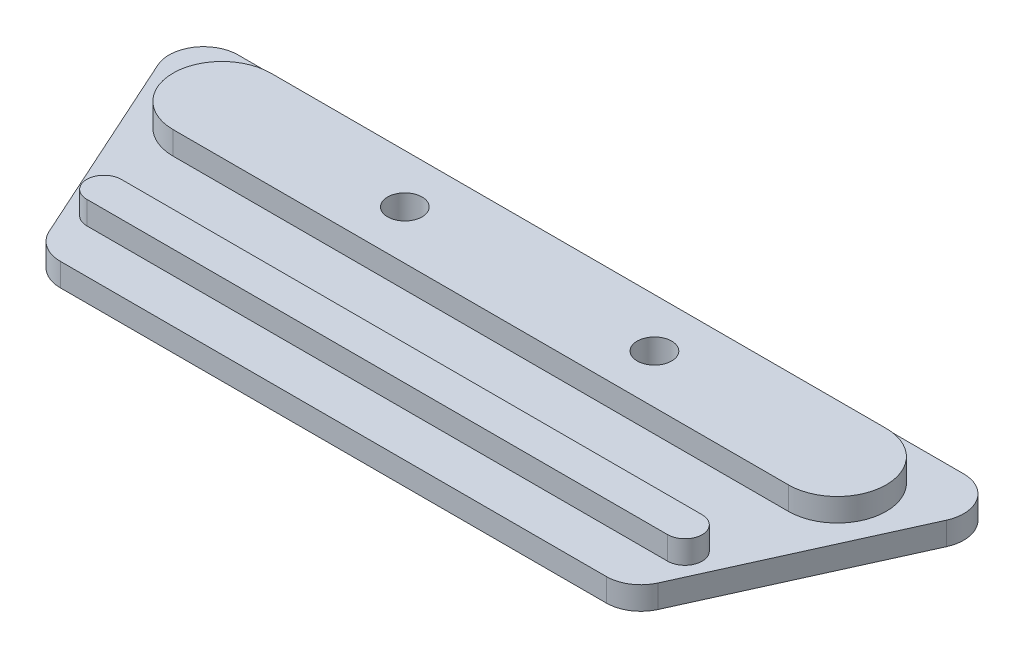
ISO-10303-21;
HEADER;
FILE_DESCRIPTION(('STEP AP214'),'2;1');
FILE_NAME('part.step','',(''),(''),'','','');
FILE_SCHEMA(('AUTOMOTIVE_DESIGN { 1 0 10303 214 1 1 1 1 }'));
ENDSEC;
DATA;
#1=APPLICATION_CONTEXT('core data for automotive mechanical design processes');
#2=APPLICATION_PROTOCOL_DEFINITION('international standard','automotive_design',2000,#1);
#3=PRODUCT_CONTEXT('',#1,'mechanical');
#4=PRODUCT('Part','Part','',(#3));
#5=PRODUCT_RELATED_PRODUCT_CATEGORY('part','',(#4));
#6=PRODUCT_DEFINITION_FORMATION('','',#4);
#7=PRODUCT_DEFINITION_CONTEXT('part definition',#1,'design');
#8=PRODUCT_DEFINITION('design','',#6,#7);
#9=PRODUCT_DEFINITION_SHAPE('','',#8);
#10=(LENGTH_UNIT() NAMED_UNIT(*) SI_UNIT(.MILLI.,.METRE.));
#11=(NAMED_UNIT(*) PLANE_ANGLE_UNIT() SI_UNIT($,.RADIAN.));
#12=(NAMED_UNIT(*) SI_UNIT($,.STERADIAN.) SOLID_ANGLE_UNIT());
#13=UNCERTAINTY_MEASURE_WITH_UNIT(LENGTH_MEASURE(1.E-05),#10,'distance_accuracy_value','');
#14=(GEOMETRIC_REPRESENTATION_CONTEXT(3) GLOBAL_UNCERTAINTY_ASSIGNED_CONTEXT((#13)) GLOBAL_UNIT_ASSIGNED_CONTEXT((#10,
#11,#12)) REPRESENTATION_CONTEXT('',''));
#15=CARTESIAN_POINT('',(0.,0.,0.));
#16=DIRECTION('',(0.,0.,1.));
#17=DIRECTION('',(1.,0.,0.));
#18=AXIS2_PLACEMENT_3D('',#15,#16,#17);
#19=CARTESIAN_POINT('',(0.,2.,0.));
#20=DIRECTION('',(0.,1.,0.));
#21=DIRECTION('',(0.,0.,1.));
#22=AXIS2_PLACEMENT_3D('',#19,#20,#21);
#23=PLANE('',#22);
#24=DIRECTION('',(0.412073994231826,0.,-0.911150384556704));
#25=VECTOR('',#24,1.);
#26=CARTESIAN_POINT('',(23.3094519926705,2.,10.5418591143413));
#27=LINE('',#26,#25);
#28=CARTESIAN_POINT('',(26.4692904072244,2.,3.55503629402501));
#29=VERTEX_POINT('',#28);
#30=CARTESIAN_POINT('',(34.2779248520572,2.,-13.7108925849264));
#31=VERTEX_POINT('',#30);
#32=EDGE_CURVE('E247',#29,#31,#27,.T.);
#33=ORIENTED_EDGE('',*,*,#32,.T.);
#34=CARTESIAN_POINT('',(31.5444736983871,2.,-14.9471145676219));
#35=DIRECTION('',(0.,1.,0.));
#36=DIRECTION('',(0.,0.,1.));
#37=AXIS2_PLACEMENT_3D('',#34,#35,#36);
#38=CIRCLE('',#37,3.);
#39=CARTESIAN_POINT('',(31.544473698387,2.,-17.9471145676219));
#40=VERTEX_POINT('',#39);
#41=EDGE_CURVE('E251',#31,#40,#38,.T.);
#42=ORIENTED_EDGE('',*,*,#41,.T.);
#43=DIRECTION('',(1.,0.,0.));
#44=VECTOR('',#43,1.);
#45=CARTESIAN_POINT('',(0.,2.,-17.9471145676219));
#46=LINE('',#45,#44);
#47=CARTESIAN_POINT('',(-31.5444736983869,2.,-17.9471145676219));
#48=VERTEX_POINT('',#47);
#49=EDGE_CURVE('E255',#48,#40,#46,.T.);
#50=ORIENTED_EDGE('',*,*,#49,.F.);
#51=CARTESIAN_POINT('',(-31.5444736983869,2.,-14.9471145676219));
#52=DIRECTION('',(0.,1.,0.));
#53=DIRECTION('',(0.,0.,1.));
#54=AXIS2_PLACEMENT_3D('',#51,#52,#53);
#55=CIRCLE('',#54,3.);
#56=CARTESIAN_POINT('',(-34.277924852057,2.,-13.7108925849264));
#57=VERTEX_POINT('',#56);
#58=EDGE_CURVE('E259',#57,#48,#55,.F.);
#59=ORIENTED_EDGE('',*,*,#58,.F.);
#60=DIRECTION('',(-0.412073994231826,0.,-0.911150384556704));
#61=VECTOR('',#60,1.);
#62=CARTESIAN_POINT('',(-23.3094519926703,2.,10.5418591143413));
#63=LINE('',#62,#61);
#64=CARTESIAN_POINT('',(-26.4692904072242,2.,3.55503629402501));
#65=VERTEX_POINT('',#64);
#66=EDGE_CURVE('E263',#65,#57,#63,.T.);
#67=ORIENTED_EDGE('',*,*,#66,.F.);
#68=CARTESIAN_POINT('',(-23.7358392535541,2.,2.31881431132954));
#69=DIRECTION('',(0.,1.,0.));
#70=DIRECTION('',(0.,0.,1.));
#71=AXIS2_PLACEMENT_3D('',#68,#69,#70);
#72=CIRCLE('',#71,3.);
#73=CARTESIAN_POINT('',(-23.7358392535541,2.,5.31881431132954));
#74=VERTEX_POINT('',#73);
#75=EDGE_CURVE('E267',#74,#65,#72,.F.);
#76=ORIENTED_EDGE('',*,*,#75,.F.);
#77=DIRECTION('',(-1.,0.,0.));
#78=VECTOR('',#77,1.);
#79=CARTESIAN_POINT('',(0.,2.,5.31881431132954));
#80=LINE('',#79,#78);
#81=CARTESIAN_POINT('',(23.7358392535542,2.,5.31881431132954));
#82=VERTEX_POINT('',#81);
#83=EDGE_CURVE('E271',#82,#74,#80,.T.);
#84=ORIENTED_EDGE('',*,*,#83,.F.);
#85=CARTESIAN_POINT('',(23.7358392535542,2.,2.31881431132954));
#86=DIRECTION('',(0.,1.,0.));
#87=DIRECTION('',(0.,0.,1.));
#88=AXIS2_PLACEMENT_3D('',#85,#86,#87);
#89=CIRCLE('',#88,3.);
#90=EDGE_CURVE('E275',#82,#29,#89,.T.);
#91=ORIENTED_EDGE('',*,*,#90,.T.);
#92=EDGE_LOOP('',(#33,#42,#50,#59,#67,#76,#84,#91));
#93=FACE_BOUND('',#92,.T.);
#94=CARTESIAN_POINT('',(26.7500000000001,2.,-11.75));
#95=DIRECTION('',(0.,1.,0.));
#96=DIRECTION('',(0.,0.,1.));
#97=AXIS2_PLACEMENT_3D('',#94,#95,#96);
#98=CIRCLE('',#97,4.25);
#99=CARTESIAN_POINT('',(26.7500000000001,2.,-16.));
#100=VERTEX_POINT('',#99);
#101=CARTESIAN_POINT('',(26.7500000000001,2.,-7.5));
#102=VERTEX_POINT('',#101);
#103=EDGE_CURVE('E238',#100,#102,#98,.F.);
#104=ORIENTED_EDGE('',*,*,#103,.T.);
#105=DIRECTION('',(-1.,0.,0.));
#106=VECTOR('',#105,1.);
#107=CARTESIAN_POINT('',(0.,2.,-7.5));
#108=LINE('',#107,#106);
#109=CARTESIAN_POINT('',(-26.7499999999999,2.,-7.5));
#110=VERTEX_POINT('',#109);
#111=EDGE_CURVE('E242',#102,#110,#108,.T.);
#112=ORIENTED_EDGE('',*,*,#111,.T.);
#113=CARTESIAN_POINT('',(-26.7499999999999,2.,-11.75));
#114=DIRECTION('',(0.,1.,0.));
#115=DIRECTION('',(0.,0.,1.));
#116=AXIS2_PLACEMENT_3D('',#113,#114,#115);
#117=CIRCLE('',#116,4.25);
#118=CARTESIAN_POINT('',(-26.7499999999999,2.,-16.));
#119=VERTEX_POINT('',#118);
#120=EDGE_CURVE('E230',#110,#119,#117,.F.);
#121=ORIENTED_EDGE('',*,*,#120,.T.);
#122=DIRECTION('',(-1.,0.,0.));
#123=VECTOR('',#122,1.);
#124=CARTESIAN_POINT('',(0.,2.,-16.));
#125=LINE('',#124,#123);
#126=EDGE_CURVE('E234',#100,#119,#125,.T.);
#127=ORIENTED_EDGE('',*,*,#126,.F.);
#128=EDGE_LOOP('',(#104,#112,#121,#127));
#129=FACE_BOUND('',#128,.T.);
#130=CARTESIAN_POINT('',(25.2500000000001,2.,0.));
#131=DIRECTION('',(0.,1.,0.));
#132=DIRECTION('',(0.,0.,1.));
#133=AXIS2_PLACEMENT_3D('',#130,#131,#132);
#134=CIRCLE('',#133,1.5);
#135=CARTESIAN_POINT('',(25.2500000000001,2.,-1.5));
#136=VERTEX_POINT('',#135);
#137=CARTESIAN_POINT('',(25.2500000000001,2.,1.5));
#138=VERTEX_POINT('',#137);
#139=EDGE_CURVE('E55',#136,#138,#134,.F.);
#140=ORIENTED_EDGE('',*,*,#139,.T.);
#141=DIRECTION('',(-1.,0.,0.));
#142=VECTOR('',#141,1.);
#143=CARTESIAN_POINT('',(0.,2.,1.5));
#144=LINE('',#143,#142);
#145=CARTESIAN_POINT('',(-25.2499999999999,2.,1.5));
#146=VERTEX_POINT('',#145);
#147=EDGE_CURVE('E175',#138,#146,#144,.T.);
#148=ORIENTED_EDGE('',*,*,#147,.T.);
#149=CARTESIAN_POINT('',(-25.2499999999999,2.,0.));
#150=DIRECTION('',(0.,1.,0.));
#151=DIRECTION('',(0.,0.,1.));
#152=AXIS2_PLACEMENT_3D('',#149,#150,#151);
#153=CIRCLE('',#152,1.5);
#154=CARTESIAN_POINT('',(-25.2499999999999,2.,-1.5));
#155=VERTEX_POINT('',#154);
#156=EDGE_CURVE('E177',#155,#146,#153,.T.);
#157=ORIENTED_EDGE('',*,*,#156,.F.);
#158=DIRECTION('',(-1.,0.,0.));
#159=VECTOR('',#158,1.);
#160=CARTESIAN_POINT('',(0.,2.,-1.5));
#161=LINE('',#160,#159);
#162=EDGE_CURVE('E60',#136,#155,#161,.T.);
#163=ORIENTED_EDGE('',*,*,#162,.F.);
#164=EDGE_LOOP('',(#140,#148,#157,#163));
#165=FACE_BOUND('',#164,.T.);
#166=ADVANCED_FACE('F39',(#93,#129,#165),#23,.T.);
#167=CARTESIAN_POINT('',(23.3094519926705,2.,10.5418591143413));
#168=DIRECTION('',(-0.911150384556704,0.,-0.412073994231826));
#169=DIRECTION('',(-0.412073994231826,0.,0.911150384556704));
#170=AXIS2_PLACEMENT_3D('',#167,#168,#169);
#171=PLANE('',#170);
#172=DIRECTION('',(0.412073994231826,0.,-0.911150384556704));
#173=VECTOR('',#172,1.);
#174=CARTESIAN_POINT('',(23.3094519926705,0.,10.5418591143413));
#175=LINE('',#174,#173);
#176=CARTESIAN_POINT('',(26.4692904072244,0.,3.55503629402501));
#177=VERTEX_POINT('',#176);
#178=CARTESIAN_POINT('',(34.2779248520572,0.,-13.7108925849264));
#179=VERTEX_POINT('',#178);
#180=EDGE_CURVE('E246',#177,#179,#175,.T.);
#181=ORIENTED_EDGE('',*,*,#180,.T.);
#182=DIRECTION('',(0.,-1.,0.));
#183=VECTOR('',#182,1.);
#184=CARTESIAN_POINT('',(34.2779248520572,2.,-13.7108925849264));
#185=LINE('',#184,#183);
#186=EDGE_CURVE('E11',#31,#179,#185,.T.);
#187=ORIENTED_EDGE('',*,*,#186,.F.);
#188=ORIENTED_EDGE('',*,*,#32,.F.);
#189=DIRECTION('',(0.,-1.,0.));
#190=VECTOR('',#189,1.);
#191=CARTESIAN_POINT('',(26.4692904072244,2.,3.55503629402501));
#192=LINE('',#191,#190);
#193=EDGE_CURVE('E278',#29,#177,#192,.T.);
#194=ORIENTED_EDGE('',*,*,#193,.T.);
#195=EDGE_LOOP('',(#181,#187,#188,#194));
#196=FACE_BOUND('',#195,.T.);
#197=ADVANCED_FACE('F41',(#196),#171,.F.);
#198=CARTESIAN_POINT('',(31.5444736983871,2.,-14.9471145676219));
#199=DIRECTION('',(0.,-1.,0.));
#200=DIRECTION('',(0.,0.,-1.));
#201=AXIS2_PLACEMENT_3D('',#198,#199,#200);
#202=CYLINDRICAL_SURFACE('',#201,3.);
#203=CARTESIAN_POINT('',(31.5444736983871,0.,-14.9471145676219));
#204=DIRECTION('',(0.,1.,0.));
#205=DIRECTION('',(0.,0.,1.));
#206=AXIS2_PLACEMENT_3D('',#203,#204,#205);
#207=CIRCLE('',#206,3.);
#208=CARTESIAN_POINT('',(31.544473698387,0.,-17.9471145676219));
#209=VERTEX_POINT('',#208);
#210=EDGE_CURVE('E282',#179,#209,#207,.T.);
#211=ORIENTED_EDGE('',*,*,#210,.T.);
#212=DIRECTION('',(0.,-1.,0.));
#213=VECTOR('',#212,1.);
#214=CARTESIAN_POINT('',(31.544473698387,2.,-17.9471145676219));
#215=LINE('',#214,#213);
#216=EDGE_CURVE('E48',#40,#209,#215,.T.);
#217=ORIENTED_EDGE('',*,*,#216,.F.);
#218=ORIENTED_EDGE('',*,*,#41,.F.);
#219=ORIENTED_EDGE('',*,*,#186,.T.);
#220=EDGE_LOOP('',(#211,#217,#218,#219));
#221=FACE_BOUND('',#220,.T.);
#222=ADVANCED_FACE('F340',(#221),#202,.T.);
#223=CARTESIAN_POINT('',(0.,2.,-17.9471145676219));
#224=DIRECTION('',(0.,0.,-1.));
#225=DIRECTION('',(-1.,0.,0.));
#226=AXIS2_PLACEMENT_3D('',#223,#224,#225);
#227=PLANE('',#226);
#228=DIRECTION('',(1.,0.,0.));
#229=VECTOR('',#228,1.);
#230=CARTESIAN_POINT('',(0.,0.,-17.9471145676219));
#231=LINE('',#230,#229);
#232=CARTESIAN_POINT('',(-31.5444736983869,0.,-17.9471145676219));
#233=VERTEX_POINT('',#232);
#234=EDGE_CURVE('E286',#233,#209,#231,.T.);
#235=ORIENTED_EDGE('',*,*,#234,.F.);
#236=DIRECTION('',(0.,-1.,0.));
#237=VECTOR('',#236,1.);
#238=CARTESIAN_POINT('',(-31.5444736983869,2.,-17.9471145676219));
#239=LINE('',#238,#237);
#240=EDGE_CURVE('E331',#48,#233,#239,.T.);
#241=ORIENTED_EDGE('',*,*,#240,.F.);
#242=ORIENTED_EDGE('',*,*,#49,.T.);
#243=ORIENTED_EDGE('',*,*,#216,.T.);
#244=EDGE_LOOP('',(#235,#241,#242,#243));
#245=FACE_BOUND('',#244,.T.);
#246=ADVANCED_FACE('F337',(#245),#227,.T.);
#247=CARTESIAN_POINT('',(-31.5444736983869,2.,-14.9471145676219));
#248=DIRECTION('',(0.,-1.,0.));
#249=DIRECTION('',(0.,0.,-1.));
#250=AXIS2_PLACEMENT_3D('',#247,#248,#249);
#251=CYLINDRICAL_SURFACE('',#250,3.);
#252=CARTESIAN_POINT('',(-31.5444736983869,0.,-14.9471145676219));
#253=DIRECTION('',(0.,1.,0.));
#254=DIRECTION('',(0.,0.,1.));
#255=AXIS2_PLACEMENT_3D('',#252,#253,#254);
#256=CIRCLE('',#255,3.);
#257=CARTESIAN_POINT('',(-34.277924852057,0.,-13.7108925849264));
#258=VERTEX_POINT('',#257);
#259=EDGE_CURVE('E290',#258,#233,#256,.F.);
#260=ORIENTED_EDGE('',*,*,#259,.F.);
#261=DIRECTION('',(0.,-1.,0.));
#262=VECTOR('',#261,1.);
#263=CARTESIAN_POINT('',(-34.277924852057,2.,-13.7108925849264));
#264=LINE('',#263,#262);
#265=EDGE_CURVE('E328',#57,#258,#264,.T.);
#266=ORIENTED_EDGE('',*,*,#265,.F.);
#267=ORIENTED_EDGE('',*,*,#58,.T.);
#268=ORIENTED_EDGE('',*,*,#240,.T.);
#269=EDGE_LOOP('',(#260,#266,#267,#268));
#270=FACE_BOUND('',#269,.T.);
#271=ADVANCED_FACE('F349',(#270),#251,.T.);
#272=CARTESIAN_POINT('',(-23.3094519926703,2.,10.5418591143413));
#273=DIRECTION('',(-0.911150384556704,0.,0.412073994231826));
#274=DIRECTION('',(0.412073994231826,0.,0.911150384556704));
#275=AXIS2_PLACEMENT_3D('',#272,#273,#274);
#276=PLANE('',#275);
#277=DIRECTION('',(-0.412073994231826,0.,-0.911150384556704));
#278=VECTOR('',#277,1.);
#279=CARTESIAN_POINT('',(-23.3094519926703,0.,10.5418591143413));
#280=LINE('',#279,#278);
#281=CARTESIAN_POINT('',(-26.4692904072242,0.,3.55503629402501));
#282=VERTEX_POINT('',#281);
#283=EDGE_CURVE('E294',#282,#258,#280,.T.);
#284=ORIENTED_EDGE('',*,*,#283,.F.);
#285=DIRECTION('',(0.,-1.,0.));
#286=VECTOR('',#285,1.);
#287=CARTESIAN_POINT('',(-26.4692904072242,2.,3.55503629402501));
#288=LINE('',#287,#286);
#289=EDGE_CURVE('E325',#65,#282,#288,.T.);
#290=ORIENTED_EDGE('',*,*,#289,.F.);
#291=ORIENTED_EDGE('',*,*,#66,.T.);
#292=ORIENTED_EDGE('',*,*,#265,.T.);
#293=EDGE_LOOP('',(#284,#290,#291,#292));
#294=FACE_BOUND('',#293,.T.);
#295=ADVANCED_FACE('F369',(#294),#276,.T.);
#296=CARTESIAN_POINT('',(-23.7358392535541,2.,2.31881431132954));
#297=DIRECTION('',(0.,-1.,0.));
#298=DIRECTION('',(0.,0.,-1.));
#299=AXIS2_PLACEMENT_3D('',#296,#297,#298);
#300=CYLINDRICAL_SURFACE('',#299,3.);
#301=CARTESIAN_POINT('',(-23.7358392535541,0.,2.31881431132954));
#302=DIRECTION('',(0.,1.,0.));
#303=DIRECTION('',(0.,0.,1.));
#304=AXIS2_PLACEMENT_3D('',#301,#302,#303);
#305=CIRCLE('',#304,3.);
#306=CARTESIAN_POINT('',(-23.7358392535541,0.,5.31881431132954));
#307=VERTEX_POINT('',#306);
#308=EDGE_CURVE('E298',#307,#282,#305,.F.);
#309=ORIENTED_EDGE('',*,*,#308,.F.);
#310=DIRECTION('',(0.,-1.,0.));
#311=VECTOR('',#310,1.);
#312=CARTESIAN_POINT('',(-23.7358392535541,2.,5.31881431132954));
#313=LINE('',#312,#311);
#314=EDGE_CURVE('E322',#74,#307,#313,.T.);
#315=ORIENTED_EDGE('',*,*,#314,.F.);
#316=ORIENTED_EDGE('',*,*,#75,.T.);
#317=ORIENTED_EDGE('',*,*,#289,.T.);
#318=EDGE_LOOP('',(#309,#315,#316,#317));
#319=FACE_BOUND('',#318,.T.);
#320=ADVANCED_FACE('F367',(#319),#300,.T.);
#321=CARTESIAN_POINT('',(0.,2.,5.31881431132954));
#322=DIRECTION('',(0.,0.,1.));
#323=DIRECTION('',(1.,0.,0.));
#324=AXIS2_PLACEMENT_3D('',#321,#322,#323);
#325=PLANE('',#324);
#326=DIRECTION('',(-1.,0.,0.));
#327=VECTOR('',#326,1.);
#328=CARTESIAN_POINT('',(0.,0.,5.31881431132954));
#329=LINE('',#328,#327);
#330=CARTESIAN_POINT('',(23.7358392535542,0.,5.31881431132954));
#331=VERTEX_POINT('',#330);
#332=EDGE_CURVE('E302',#331,#307,#329,.T.);
#333=ORIENTED_EDGE('',*,*,#332,.F.);
#334=DIRECTION('',(0.,-1.,0.));
#335=VECTOR('',#334,1.);
#336=CARTESIAN_POINT('',(23.7358392535542,2.,5.31881431132954));
#337=LINE('',#336,#335);
#338=EDGE_CURVE('E319',#82,#331,#337,.T.);
#339=ORIENTED_EDGE('',*,*,#338,.F.);
#340=ORIENTED_EDGE('',*,*,#83,.T.);
#341=ORIENTED_EDGE('',*,*,#314,.T.);
#342=EDGE_LOOP('',(#333,#339,#340,#341));
#343=FACE_BOUND('',#342,.T.);
#344=ADVANCED_FACE('F363',(#343),#325,.T.);
#345=CARTESIAN_POINT('',(-10.8499999999999,2.,-11.75));
#346=DIRECTION('',(0.,-1.,0.));
#347=DIRECTION('',(0.,0.,-1.));
#348=AXIS2_PLACEMENT_3D('',#345,#346,#347);
#349=CYLINDRICAL_SURFACE('',#348,1.5);
#350=CARTESIAN_POINT('',(-10.8499999999999,0.,-11.75));
#351=DIRECTION('',(0.,1.,0.));
#352=DIRECTION('',(0.,0.,1.));
#353=AXIS2_PLACEMENT_3D('',#350,#351,#352);
#354=CIRCLE('',#353,1.5);
#355=CARTESIAN_POINT('',(-10.8499999999999,0.,-10.25));
#356=VERTEX_POINT('',#355);
#357=EDGE_CURVE('E309',#356,#356,#354,.T.);
#358=ORIENTED_EDGE('',*,*,#357,.F.);
#359=EDGE_LOOP('',(#358));
#360=FACE_BOUND('',#359,.T.);
#361=CARTESIAN_POINT('',(-10.8499999999999,4.,-11.75));
#362=DIRECTION('',(0.,1.,0.));
#363=DIRECTION('',(0.,0.,1.));
#364=AXIS2_PLACEMENT_3D('',#361,#362,#363);
#365=CIRCLE('',#364,1.5);
#366=CARTESIAN_POINT('',(-10.8499999999999,4.,-10.25));
#367=VERTEX_POINT('',#366);
#368=EDGE_CURVE('E207',#367,#367,#365,.T.);
#369=ORIENTED_EDGE('',*,*,#368,.T.);
#370=EDGE_LOOP('',(#369));
#371=FACE_BOUND('',#370,.T.);
#372=ADVANCED_FACE('F394',(#360,#371),#349,.F.);
#373=CARTESIAN_POINT('',(23.7358392535542,2.,2.31881431132954));
#374=DIRECTION('',(0.,-1.,0.));
#375=DIRECTION('',(0.,0.,-1.));
#376=AXIS2_PLACEMENT_3D('',#373,#374,#375);
#377=CYLINDRICAL_SURFACE('',#376,3.);
#378=CARTESIAN_POINT('',(23.7358392535542,0.,2.31881431132954));
#379=DIRECTION('',(0.,1.,0.));
#380=DIRECTION('',(0.,0.,1.));
#381=AXIS2_PLACEMENT_3D('',#378,#379,#380);
#382=CIRCLE('',#381,3.);
#383=EDGE_CURVE('E306',#331,#177,#382,.T.);
#384=ORIENTED_EDGE('',*,*,#383,.T.);
#385=ORIENTED_EDGE('',*,*,#193,.F.);
#386=ORIENTED_EDGE('',*,*,#90,.F.);
#387=ORIENTED_EDGE('',*,*,#338,.T.);
#388=EDGE_LOOP('',(#384,#385,#386,#387));
#389=FACE_BOUND('',#388,.T.);
#390=ADVANCED_FACE('F392',(#389),#377,.T.);
#391=CARTESIAN_POINT('',(10.8500000000001,2.,-11.75));
#392=DIRECTION('',(0.,-1.,0.));
#393=DIRECTION('',(0.,0.,-1.));
#394=AXIS2_PLACEMENT_3D('',#391,#392,#393);
#395=CYLINDRICAL_SURFACE('',#394,1.5);
#396=CARTESIAN_POINT('',(10.8500000000001,0.,-11.75));
#397=DIRECTION('',(0.,1.,0.));
#398=DIRECTION('',(0.,0.,1.));
#399=AXIS2_PLACEMENT_3D('',#396,#397,#398);
#400=CIRCLE('',#399,1.5);
#401=CARTESIAN_POINT('',(10.8500000000001,0.,-10.25));
#402=VERTEX_POINT('',#401);
#403=EDGE_CURVE('E252',#402,#402,#400,.F.);
#404=ORIENTED_EDGE('',*,*,#403,.T.);
#405=EDGE_LOOP('',(#404));
#406=FACE_BOUND('',#405,.T.);
#407=CARTESIAN_POINT('',(10.8500000000001,4.,-11.75));
#408=DIRECTION('',(0.,1.,0.));
#409=DIRECTION('',(0.,0.,1.));
#410=AXIS2_PLACEMENT_3D('',#407,#408,#409);
#411=CIRCLE('',#410,1.5);
#412=CARTESIAN_POINT('',(10.8500000000001,4.,-10.25));
#413=VERTEX_POINT('',#412);
#414=EDGE_CURVE('E211',#413,#413,#411,.F.);
#415=ORIENTED_EDGE('',*,*,#414,.F.);
#416=EDGE_LOOP('',(#415));
#417=FACE_BOUND('',#416,.T.);
#418=ADVANCED_FACE('F389',(#406,#417),#395,.F.);
#419=CARTESIAN_POINT('',(0.,0.,0.));
#420=DIRECTION('',(0.,1.,0.));
#421=DIRECTION('',(0.,0.,1.));
#422=AXIS2_PLACEMENT_3D('',#419,#420,#421);
#423=PLANE('',#422);
#424=ORIENTED_EDGE('',*,*,#180,.F.);
#425=ORIENTED_EDGE('',*,*,#383,.F.);
#426=ORIENTED_EDGE('',*,*,#332,.T.);
#427=ORIENTED_EDGE('',*,*,#308,.T.);
#428=ORIENTED_EDGE('',*,*,#283,.T.);
#429=ORIENTED_EDGE('',*,*,#259,.T.);
#430=ORIENTED_EDGE('',*,*,#234,.T.);
#431=ORIENTED_EDGE('',*,*,#210,.F.);
#432=EDGE_LOOP('',(#424,#425,#426,#427,#428,#429,#430,#431));
#433=FACE_BOUND('',#432,.T.);
#434=ORIENTED_EDGE('',*,*,#403,.F.);
#435=EDGE_LOOP('',(#434));
#436=FACE_BOUND('',#435,.T.);
#437=ORIENTED_EDGE('',*,*,#357,.T.);
#438=EDGE_LOOP('',(#437));
#439=FACE_BOUND('',#438,.T.);
#440=ADVANCED_FACE('F344',(#433,#436,#439),#423,.F.);
#441=CARTESIAN_POINT('',(0.,4.,-7.5));
#442=DIRECTION('',(0.,0.,-1.));
#443=DIRECTION('',(-1.,0.,0.));
#444=AXIS2_PLACEMENT_3D('',#441,#442,#443);
#445=PLANE('',#444);
#446=ORIENTED_EDGE('',*,*,#111,.F.);
#447=DIRECTION('',(0.,-1.,0.));
#448=VECTOR('',#447,1.);
#449=CARTESIAN_POINT('',(26.7500000000001,4.,-7.5));
#450=LINE('',#449,#448);
#451=CARTESIAN_POINT('',(26.7500000000001,4.,-7.5));
#452=VERTEX_POINT('',#451);
#453=EDGE_CURVE('E226',#452,#102,#450,.T.);
#454=ORIENTED_EDGE('',*,*,#453,.F.);
#455=DIRECTION('',(1.,0.,0.));
#456=VECTOR('',#455,1.);
#457=CARTESIAN_POINT('',(0.,4.,-7.5));
#458=LINE('',#457,#456);
#459=CARTESIAN_POINT('',(-26.7499999999999,4.,-7.5));
#460=VERTEX_POINT('',#459);
#461=EDGE_CURVE('E193',#460,#452,#458,.T.);
#462=ORIENTED_EDGE('',*,*,#461,.F.);
#463=DIRECTION('',(0.,-1.,0.));
#464=VECTOR('',#463,1.);
#465=CARTESIAN_POINT('',(-26.7499999999999,4.,-7.5));
#466=LINE('',#465,#464);
#467=EDGE_CURVE('E215',#460,#110,#466,.T.);
#468=ORIENTED_EDGE('',*,*,#467,.T.);
#469=EDGE_LOOP('',(#446,#454,#462,#468));
#470=FACE_BOUND('',#469,.T.);
#471=ADVANCED_FACE('F385',(#470),#445,.F.);
#472=CARTESIAN_POINT('',(26.7500000000001,4.,-11.75));
#473=DIRECTION('',(0.,-1.,0.));
#474=DIRECTION('',(0.,0.,-1.));
#475=AXIS2_PLACEMENT_3D('',#472,#473,#474);
#476=CYLINDRICAL_SURFACE('',#475,4.25);
#477=ORIENTED_EDGE('',*,*,#103,.F.);
#478=DIRECTION('',(0.,-1.,0.));
#479=VECTOR('',#478,1.);
#480=CARTESIAN_POINT('',(26.7500000000001,4.,-16.));
#481=LINE('',#480,#479);
#482=CARTESIAN_POINT('',(26.7500000000001,4.,-16.));
#483=VERTEX_POINT('',#482);
#484=EDGE_CURVE('E222',#483,#100,#481,.T.);
#485=ORIENTED_EDGE('',*,*,#484,.F.);
#486=CARTESIAN_POINT('',(26.7500000000001,4.,-11.75));
#487=DIRECTION('',(0.,1.,0.));
#488=DIRECTION('',(0.,0.,1.));
#489=AXIS2_PLACEMENT_3D('',#486,#487,#488);
#490=CIRCLE('',#489,4.25);
#491=EDGE_CURVE('E197',#452,#483,#490,.T.);
#492=ORIENTED_EDGE('',*,*,#491,.F.);
#493=ORIENTED_EDGE('',*,*,#453,.T.);
#494=EDGE_LOOP('',(#477,#485,#492,#493));
#495=FACE_BOUND('',#494,.T.);
#496=ADVANCED_FACE('F427',(#495),#476,.T.);
#497=CARTESIAN_POINT('',(0.,4.,-16.));
#498=DIRECTION('',(0.,0.,-1.));
#499=DIRECTION('',(-1.,0.,0.));
#500=AXIS2_PLACEMENT_3D('',#497,#498,#499);
#501=PLANE('',#500);
#502=ORIENTED_EDGE('',*,*,#484,.T.);
#503=ORIENTED_EDGE('',*,*,#126,.T.);
#504=DIRECTION('',(0.,-1.,0.));
#505=VECTOR('',#504,1.);
#506=CARTESIAN_POINT('',(-26.7499999999999,4.,-16.));
#507=LINE('',#506,#505);
#508=CARTESIAN_POINT('',(-26.7499999999999,4.,-16.));
#509=VERTEX_POINT('',#508);
#510=EDGE_CURVE('E219',#509,#119,#507,.T.);
#511=ORIENTED_EDGE('',*,*,#510,.F.);
#512=DIRECTION('',(1.,0.,0.));
#513=VECTOR('',#512,1.);
#514=CARTESIAN_POINT('',(0.,4.,-16.));
#515=LINE('',#514,#513);
#516=EDGE_CURVE('E200',#509,#483,#515,.T.);
#517=ORIENTED_EDGE('',*,*,#516,.T.);
#518=EDGE_LOOP('',(#502,#503,#511,#517));
#519=FACE_BOUND('',#518,.T.);
#520=ADVANCED_FACE('F434',(#519),#501,.T.);
#521=CARTESIAN_POINT('',(-26.7499999999999,4.,-11.75));
#522=DIRECTION('',(0.,-1.,0.));
#523=DIRECTION('',(0.,0.,-1.));
#524=AXIS2_PLACEMENT_3D('',#521,#522,#523);
#525=CYLINDRICAL_SURFACE('',#524,4.25);
#526=ORIENTED_EDGE('',*,*,#120,.F.);
#527=ORIENTED_EDGE('',*,*,#467,.F.);
#528=CARTESIAN_POINT('',(-26.7499999999999,4.,-11.75));
#529=DIRECTION('',(0.,1.,0.));
#530=DIRECTION('',(0.,0.,1.));
#531=AXIS2_PLACEMENT_3D('',#528,#529,#530);
#532=CIRCLE('',#531,4.25);
#533=EDGE_CURVE('E204',#509,#460,#532,.T.);
#534=ORIENTED_EDGE('',*,*,#533,.F.);
#535=ORIENTED_EDGE('',*,*,#510,.T.);
#536=EDGE_LOOP('',(#526,#527,#534,#535));
#537=FACE_BOUND('',#536,.T.);
#538=ADVANCED_FACE('F441',(#537),#525,.T.);
#539=CARTESIAN_POINT('',(0.,4.,0.));
#540=DIRECTION('',(0.,1.,0.));
#541=DIRECTION('',(0.,0.,1.));
#542=AXIS2_PLACEMENT_3D('',#539,#540,#541);
#543=PLANE('',#542);
#544=ORIENTED_EDGE('',*,*,#461,.T.);
#545=ORIENTED_EDGE('',*,*,#491,.T.);
#546=ORIENTED_EDGE('',*,*,#516,.F.);
#547=ORIENTED_EDGE('',*,*,#533,.T.);
#548=EDGE_LOOP('',(#544,#545,#546,#547));
#549=FACE_BOUND('',#548,.T.);
#550=ORIENTED_EDGE('',*,*,#368,.F.);
#551=EDGE_LOOP('',(#550));
#552=FACE_BOUND('',#551,.T.);
#553=ORIENTED_EDGE('',*,*,#414,.T.);
#554=EDGE_LOOP('',(#553));
#555=FACE_BOUND('',#554,.T.);
#556=ADVANCED_FACE('F449',(#549,#552,#555),#543,.T.);
#557=CARTESIAN_POINT('',(0.,4.,1.5));
#558=DIRECTION('',(0.,0.,-1.));
#559=DIRECTION('',(-1.,0.,0.));
#560=AXIS2_PLACEMENT_3D('',#557,#558,#559);
#561=PLANE('',#560);
#562=ORIENTED_EDGE('',*,*,#147,.F.);
#563=DIRECTION('',(0.,-1.,0.));
#564=VECTOR('',#563,1.);
#565=CARTESIAN_POINT('',(25.2500000000001,4.,1.5));
#566=LINE('',#565,#564);
#567=CARTESIAN_POINT('',(25.2500000000001,4.,1.5));
#568=VERTEX_POINT('',#567);
#569=EDGE_CURVE('E155',#568,#138,#566,.T.);
#570=ORIENTED_EDGE('',*,*,#569,.F.);
#571=DIRECTION('',(1.,0.,0.));
#572=VECTOR('',#571,1.);
#573=CARTESIAN_POINT('',(0.,4.,1.5));
#574=LINE('',#573,#572);
#575=CARTESIAN_POINT('',(-25.2499999999999,4.,1.5));
#576=VERTEX_POINT('',#575);
#577=EDGE_CURVE('E163',#576,#568,#574,.T.);
#578=ORIENTED_EDGE('',*,*,#577,.F.);
#579=DIRECTION('',(0.,-1.,0.));
#580=VECTOR('',#579,1.);
#581=CARTESIAN_POINT('',(-25.2499999999999,4.,1.5));
#582=LINE('',#581,#580);
#583=EDGE_CURVE('E583',#576,#146,#582,.T.);
#584=ORIENTED_EDGE('',*,*,#583,.T.);
#585=EDGE_LOOP('',(#562,#570,#578,#584));
#586=FACE_BOUND('',#585,.T.);
#587=ADVANCED_FACE('F174',(#586),#561,.F.);
#588=CARTESIAN_POINT('',(25.2500000000001,4.,0.));
#589=DIRECTION('',(0.,-1.,0.));
#590=DIRECTION('',(0.,0.,-1.));
#591=AXIS2_PLACEMENT_3D('',#588,#589,#590);
#592=CYLINDRICAL_SURFACE('',#591,1.5);
#593=ORIENTED_EDGE('',*,*,#139,.F.);
#594=DIRECTION('',(0.,-1.,0.));
#595=VECTOR('',#594,1.);
#596=CARTESIAN_POINT('',(25.2500000000001,4.,-1.5));
#597=LINE('',#596,#595);
#598=CARTESIAN_POINT('',(25.2500000000001,4.,-1.5));
#599=VERTEX_POINT('',#598);
#600=EDGE_CURVE('E157',#599,#136,#597,.T.);
#601=ORIENTED_EDGE('',*,*,#600,.F.);
#602=CARTESIAN_POINT('',(25.2500000000001,4.,0.));
#603=DIRECTION('',(0.,1.,0.));
#604=DIRECTION('',(0.,0.,1.));
#605=AXIS2_PLACEMENT_3D('',#602,#603,#604);
#606=CIRCLE('',#605,1.5);
#607=EDGE_CURVE('E151',#568,#599,#606,.T.);
#608=ORIENTED_EDGE('',*,*,#607,.F.);
#609=ORIENTED_EDGE('',*,*,#569,.T.);
#610=EDGE_LOOP('',(#593,#601,#608,#609));
#611=FACE_BOUND('',#610,.T.);
#612=ADVANCED_FACE('F153',(#611),#592,.T.);
#613=CARTESIAN_POINT('',(0.,4.,-1.5));
#614=DIRECTION('',(0.,0.,-1.));
#615=DIRECTION('',(-1.,0.,0.));
#616=AXIS2_PLACEMENT_3D('',#613,#614,#615);
#617=PLANE('',#616);
#618=ORIENTED_EDGE('',*,*,#600,.T.);
#619=ORIENTED_EDGE('',*,*,#162,.T.);
#620=DIRECTION('',(0.,-1.,0.));
#621=VECTOR('',#620,1.);
#622=CARTESIAN_POINT('',(-25.2499999999999,4.,-1.5));
#623=LINE('',#622,#621);
#624=CARTESIAN_POINT('',(-25.2499999999999,4.,-1.5));
#625=VERTEX_POINT('',#624);
#626=EDGE_CURVE('E183',#625,#155,#623,.T.);
#627=ORIENTED_EDGE('',*,*,#626,.F.);
#628=DIRECTION('',(1.,0.,0.));
#629=VECTOR('',#628,1.);
#630=CARTESIAN_POINT('',(0.,4.,-1.5));
#631=LINE('',#630,#629);
#632=EDGE_CURVE('E162',#625,#599,#631,.T.);
#633=ORIENTED_EDGE('',*,*,#632,.T.);
#634=EDGE_LOOP('',(#618,#619,#627,#633));
#635=FACE_BOUND('',#634,.T.);
#636=ADVANCED_FACE('F470',(#635),#617,.T.);
#637=CARTESIAN_POINT('',(-25.2499999999999,4.,0.));
#638=DIRECTION('',(0.,-1.,0.));
#639=DIRECTION('',(0.,0.,-1.));
#640=AXIS2_PLACEMENT_3D('',#637,#638,#639);
#641=CYLINDRICAL_SURFACE('',#640,1.5);
#642=ORIENTED_EDGE('',*,*,#626,.T.);
#643=ORIENTED_EDGE('',*,*,#156,.T.);
#644=ORIENTED_EDGE('',*,*,#583,.F.);
#645=CARTESIAN_POINT('',(-25.2499999999999,4.,0.));
#646=DIRECTION('',(0.,1.,0.));
#647=DIRECTION('',(0.,0.,1.));
#648=AXIS2_PLACEMENT_3D('',#645,#646,#647);
#649=CIRCLE('',#648,1.5);
#650=EDGE_CURVE('E169',#576,#625,#649,.F.);
#651=ORIENTED_EDGE('',*,*,#650,.T.);
#652=EDGE_LOOP('',(#642,#643,#644,#651));
#653=FACE_BOUND('',#652,.T.);
#654=ADVANCED_FACE('F477',(#653),#641,.T.);
#655=CARTESIAN_POINT('',(0.,4.,0.));
#656=DIRECTION('',(0.,1.,0.));
#657=DIRECTION('',(0.,0.,1.));
#658=AXIS2_PLACEMENT_3D('',#655,#656,#657);
#659=PLANE('',#658);
#660=ORIENTED_EDGE('',*,*,#577,.T.);
#661=ORIENTED_EDGE('',*,*,#607,.T.);
#662=ORIENTED_EDGE('',*,*,#632,.F.);
#663=ORIENTED_EDGE('',*,*,#650,.F.);
#664=EDGE_LOOP('',(#660,#661,#662,#663));
#665=FACE_BOUND('',#664,.T.);
#666=ADVANCED_FACE('F167',(#665),#659,.T.);
#667=CLOSED_SHELL('',(#166,#197,#222,#246,#271,#295,#320,#344,#372,#390,#418,#440,#471,#496,
#520,#538,#556,#587,#612,#636,#654,#666));
#668=MANIFOLD_SOLID_BREP('B2',#667);
#669=ADVANCED_BREP_SHAPE_REPRESENTATION('',(#18,#668),#14);
#670=SHAPE_DEFINITION_REPRESENTATION(#9,#669);
ENDSEC;
END-ISO-10303-21;
